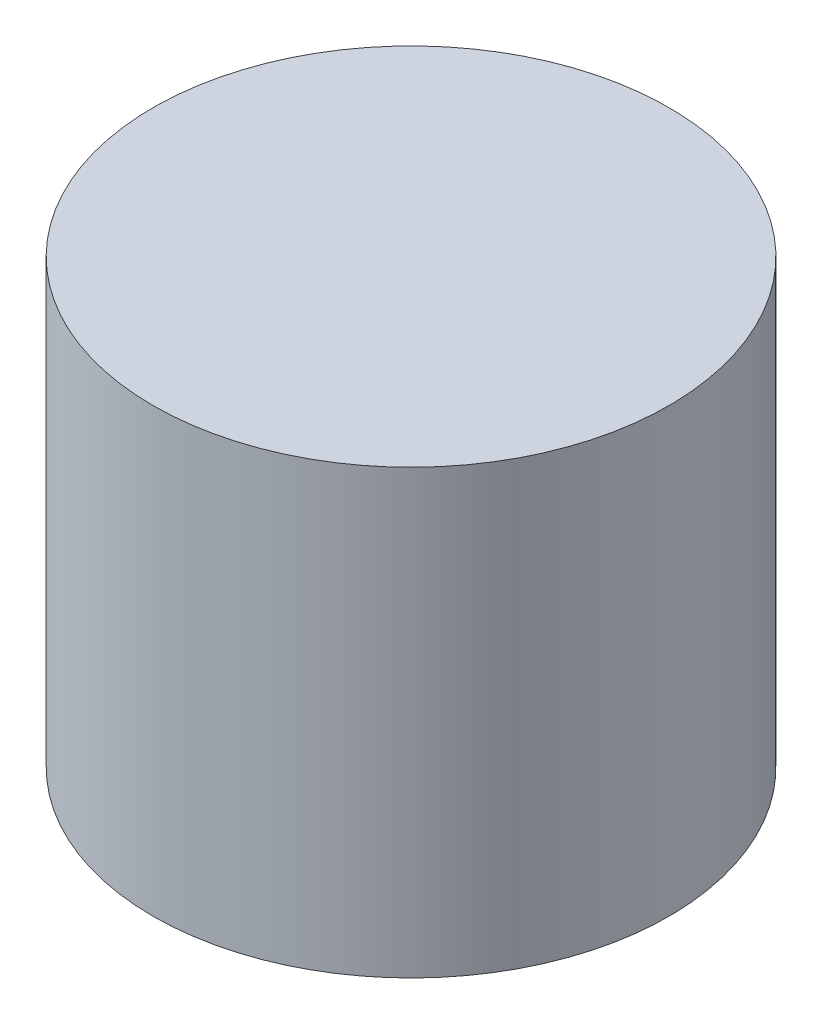
ISO-10303-21;
HEADER;
FILE_DESCRIPTION(('STEP AP214'),'2;1');
FILE_NAME('part.step','',(''),(''),'','','');
FILE_SCHEMA(('AUTOMOTIVE_DESIGN { 1 0 10303 214 1 1 1 1 }'));
ENDSEC;
DATA;
#1=APPLICATION_CONTEXT('core data for automotive mechanical design processes');
#2=APPLICATION_PROTOCOL_DEFINITION('international standard','automotive_design',2000,#1);
#3=PRODUCT_CONTEXT('',#1,'mechanical');
#4=PRODUCT('Part','Part','',(#3));
#5=PRODUCT_RELATED_PRODUCT_CATEGORY('part','',(#4));
#6=PRODUCT_DEFINITION_FORMATION('','',#4);
#7=PRODUCT_DEFINITION_CONTEXT('part definition',#1,'design');
#8=PRODUCT_DEFINITION('design','',#6,#7);
#9=PRODUCT_DEFINITION_SHAPE('','',#8);
#10=(LENGTH_UNIT() NAMED_UNIT(*) SI_UNIT(.MILLI.,.METRE.));
#11=(NAMED_UNIT(*) PLANE_ANGLE_UNIT() SI_UNIT($,.RADIAN.));
#12=(NAMED_UNIT(*) SI_UNIT($,.STERADIAN.) SOLID_ANGLE_UNIT());
#13=UNCERTAINTY_MEASURE_WITH_UNIT(LENGTH_MEASURE(1.E-05),#10,'distance_accuracy_value','');
#14=(GEOMETRIC_REPRESENTATION_CONTEXT(3) GLOBAL_UNCERTAINTY_ASSIGNED_CONTEXT((#13)) GLOBAL_UNIT_ASSIGNED_CONTEXT((#10,
#11,#12)) REPRESENTATION_CONTEXT('',''));
#15=CARTESIAN_POINT('',(0.,0.,0.));
#16=DIRECTION('',(0.,0.,1.));
#17=DIRECTION('',(1.,0.,0.));
#18=AXIS2_PLACEMENT_3D('',#15,#16,#17);
#19=CARTESIAN_POINT('',(0.,3.,0.));
#20=DIRECTION('',(0.,-1.,0.));
#21=DIRECTION('',(0.,0.,-1.));
#22=AXIS2_PLACEMENT_3D('',#19,#20,#21);
#23=CYLINDRICAL_SURFACE('',#22,1.75);
#24=CARTESIAN_POINT('',(0.,3.,0.));
#25=DIRECTION('',(0.,1.,0.));
#26=DIRECTION('',(0.,0.,1.));
#27=AXIS2_PLACEMENT_3D('',#24,#25,#26);
#28=CIRCLE('',#27,1.75);
#29=CARTESIAN_POINT('',(0.,3.,1.75));
#30=VERTEX_POINT('',#29);
#31=EDGE_CURVE('E10',#30,#30,#28,.T.);
#32=ORIENTED_EDGE('',*,*,#31,.F.);
#33=EDGE_LOOP('',(#32));
#34=FACE_BOUND('',#33,.T.);
#35=CARTESIAN_POINT('',(0.,0.,0.));
#36=DIRECTION('',(0.,1.,0.));
#37=DIRECTION('',(0.,0.,1.));
#38=AXIS2_PLACEMENT_3D('',#35,#36,#37);
#39=CIRCLE('',#38,1.75);
#40=CARTESIAN_POINT('',(0.,0.,1.75));
#41=VERTEX_POINT('',#40);
#42=EDGE_CURVE('E34',#41,#41,#39,.T.);
#43=ORIENTED_EDGE('',*,*,#42,.T.);
#44=EDGE_LOOP('',(#43));
#45=FACE_BOUND('',#44,.T.);
#46=ADVANCED_FACE('F31',(#34,#45),#23,.T.);
#47=CARTESIAN_POINT('',(0.,3.,0.));
#48=DIRECTION('',(0.,1.,0.));
#49=DIRECTION('',(0.,0.,1.));
#50=AXIS2_PLACEMENT_3D('',#47,#48,#49);
#51=PLANE('',#50);
#52=ORIENTED_EDGE('',*,*,#31,.T.);
#53=EDGE_LOOP('',(#52));
#54=FACE_BOUND('',#53,.T.);
#55=ADVANCED_FACE('F46',(#54),#51,.T.);
#56=CARTESIAN_POINT('',(0.,0.,0.));
#57=DIRECTION('',(0.,1.,0.));
#58=DIRECTION('',(0.,0.,1.));
#59=AXIS2_PLACEMENT_3D('',#56,#57,#58);
#60=PLANE('',#59);
#61=ORIENTED_EDGE('',*,*,#42,.F.);
#62=EDGE_LOOP('',(#61));
#63=FACE_BOUND('',#62,.T.);
#64=ADVANCED_FACE('F44',(#63),#60,.F.);
#65=CLOSED_SHELL('',(#46,#55,#64));
#66=MANIFOLD_SOLID_BREP('B2',#65);
#67=ADVANCED_BREP_SHAPE_REPRESENTATION('',(#18,#66),#14);
#68=SHAPE_DEFINITION_REPRESENTATION(#9,#67);
ENDSEC;
END-ISO-10303-21;
